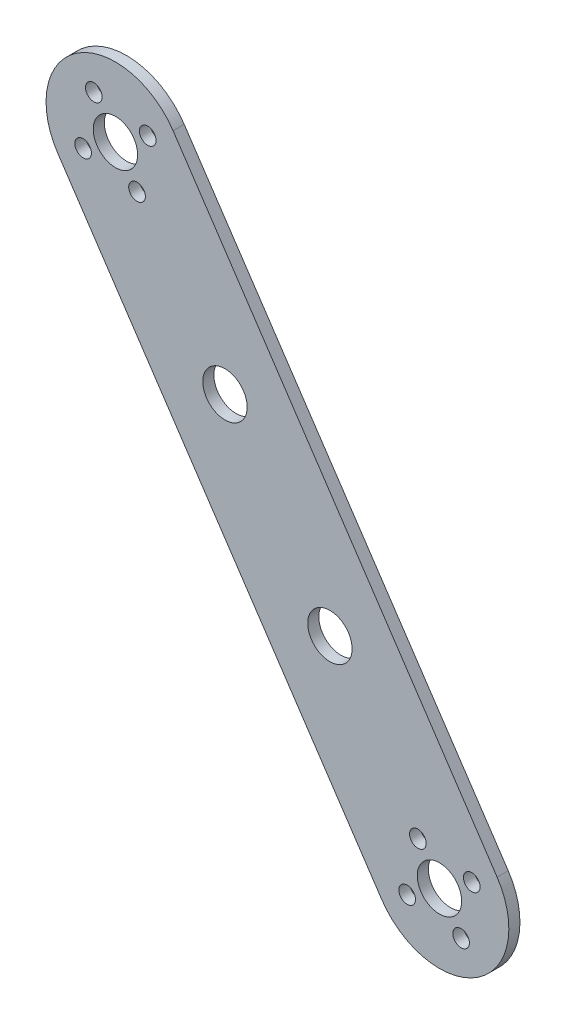
ISO-10303-21;
HEADER;
FILE_DESCRIPTION(('STEP AP214'),'2;1');
FILE_NAME('part.step','',(''),(''),'','','');
FILE_SCHEMA(('AUTOMOTIVE_DESIGN { 1 0 10303 214 1 1 1 1 }'));
ENDSEC;
DATA;
#1=APPLICATION_CONTEXT('core data for automotive mechanical design processes');
#2=APPLICATION_PROTOCOL_DEFINITION('international standard','automotive_design',2000,#1);
#3=PRODUCT_CONTEXT('',#1,'mechanical');
#4=PRODUCT('Part','Part','',(#3));
#5=PRODUCT_RELATED_PRODUCT_CATEGORY('part','',(#4));
#6=PRODUCT_DEFINITION_FORMATION('','',#4);
#7=PRODUCT_DEFINITION_CONTEXT('part definition',#1,'design');
#8=PRODUCT_DEFINITION('design','',#6,#7);
#9=PRODUCT_DEFINITION_SHAPE('','',#8);
#10=(LENGTH_UNIT() NAMED_UNIT(*) SI_UNIT(.MILLI.,.METRE.));
#11=(NAMED_UNIT(*) PLANE_ANGLE_UNIT() SI_UNIT($,.RADIAN.));
#12=(NAMED_UNIT(*) SI_UNIT($,.STERADIAN.) SOLID_ANGLE_UNIT());
#13=UNCERTAINTY_MEASURE_WITH_UNIT(LENGTH_MEASURE(1.E-05),#10,'distance_accuracy_value','');
#14=(GEOMETRIC_REPRESENTATION_CONTEXT(3) GLOBAL_UNCERTAINTY_ASSIGNED_CONTEXT((#13)) GLOBAL_UNIT_ASSIGNED_CONTEXT((#10,
#11,#12)) REPRESENTATION_CONTEXT('',''));
#15=CARTESIAN_POINT('',(0.,0.,0.));
#16=DIRECTION('',(0.,0.,1.));
#17=DIRECTION('',(1.,0.,0.));
#18=AXIS2_PLACEMENT_3D('',#15,#16,#17);
#19=CARTESIAN_POINT('',(-13.4999999999962,30.4999999999831,2.));
#20=DIRECTION('',(0.,0.,1.));
#21=DIRECTION('',(1.,0.,0.));
#22=AXIS2_PLACEMENT_3D('',#19,#20,#21);
#23=PLANE('',#22);
#24=CARTESIAN_POINT('',(-13.4999999999962,30.4999999999831,2.));
#25=DIRECTION('',(0.,0.,1.));
#26=DIRECTION('',(1.,0.,0.));
#27=AXIS2_PLACEMENT_3D('',#24,#25,#26);
#28=CIRCLE('',#27,4.);
#29=CARTESIAN_POINT('',(-9.49999999999621,30.4999999999831,2.));
#30=VERTEX_POINT('',#29);
#31=EDGE_CURVE('E170',#30,#30,#28,.T.);
#32=ORIENTED_EDGE('',*,*,#31,.F.);
#33=EDGE_LOOP('',(#32));
#34=FACE_BOUND('',#33,.T.);
#35=CARTESIAN_POINT('',(-17.3919102070971,36.3183360971731,2.));
#36=DIRECTION('',(0.,0.,1.));
#37=DIRECTION('',(1.,0.,0.));
#38=AXIS2_PLACEMENT_3D('',#35,#36,#37);
#39=CIRCLE('',#38,1.5);
#40=CARTESIAN_POINT('',(-15.8919102070971,36.3183360971731,2.));
#41=VERTEX_POINT('',#40);
#42=EDGE_CURVE('E158',#41,#41,#39,.T.);
#43=ORIENTED_EDGE('',*,*,#42,.F.);
#44=EDGE_LOOP('',(#43));
#45=FACE_BOUND('',#44,.T.);
#46=CARTESIAN_POINT('',(-9.60808979289533,24.6816639027932,2.));
#47=DIRECTION('',(0.,0.,1.));
#48=DIRECTION('',(1.,0.,0.));
#49=AXIS2_PLACEMENT_3D('',#46,#47,#48);
#50=CIRCLE('',#49,1.5);
#51=CARTESIAN_POINT('',(-8.10808979289533,24.6816639027932,2.));
#52=VERTEX_POINT('',#51);
#53=EDGE_CURVE('E146',#52,#52,#50,.T.);
#54=ORIENTED_EDGE('',*,*,#53,.F.);
#55=EDGE_LOOP('',(#54));
#56=FACE_BOUND('',#55,.T.);
#57=CARTESIAN_POINT('',(-33.2375446217221,60.0072759214466,2.));
#58=DIRECTION('',(0.,0.,1.));
#59=DIRECTION('',(1.,0.,0.));
#60=AXIS2_PLACEMENT_3D('',#57,#58,#59);
#61=CIRCLE('',#60,4.);
#62=CARTESIAN_POINT('',(-29.2375446217221,60.0072759214466,2.));
#63=VERTEX_POINT('',#62);
#64=EDGE_CURVE('E134',#63,#63,#61,.T.);
#65=ORIENTED_EDGE('',*,*,#64,.F.);
#66=EDGE_LOOP('',(#65));
#67=FACE_BOUND('',#66,.T.);
#68=CARTESIAN_POINT('',(-19.3183360971862,26.6080897928823,2.));
#69=DIRECTION('',(0.,0.,1.));
#70=DIRECTION('',(1.,0.,0.));
#71=AXIS2_PLACEMENT_3D('',#68,#69,#70);
#72=CIRCLE('',#71,1.5);
#73=CARTESIAN_POINT('',(-17.8183360971862,26.6080897928823,2.));
#74=VERTEX_POINT('',#73);
#75=EDGE_CURVE('E122',#74,#74,#72,.T.);
#76=ORIENTED_EDGE('',*,*,#75,.F.);
#77=EDGE_LOOP('',(#76));
#78=FACE_BOUND('',#77,.T.);
#79=CARTESIAN_POINT('',(-52.1411084847789,88.267765536374,2.));
#80=DIRECTION('',(0.,0.,1.));
#81=DIRECTION('',(1.,0.,0.));
#82=AXIS2_PLACEMENT_3D('',#79,#80,#81);
#83=CIRCLE('',#82,4.);
#84=CARTESIAN_POINT('',(-48.1411084847789,88.267765536374,2.));
#85=VERTEX_POINT('',#84);
#86=EDGE_CURVE('E101',#85,#85,#83,.T.);
#87=ORIENTED_EDGE('',*,*,#86,.F.);
#88=EDGE_LOOP('',(#87));
#89=FACE_BOUND('',#88,.T.);
#90=CARTESIAN_POINT('',(-13.4999999999962,30.4999999999831,2.));
#91=DIRECTION('',(0.,0.,1.));
#92=DIRECTION('',(1.,0.,0.));
#93=AXIS2_PLACEMENT_3D('',#90,#91,#92);
#94=CIRCLE('',#93,12.5);
#95=CARTESIAN_POINT('',(-23.8898858878363,23.550160344447,2.));
#96=VERTEX_POINT('',#95);
#97=CARTESIAN_POINT('',(-3.11011411215734,37.449839655521,2.));
#98=VERTEX_POINT('',#97);
#99=EDGE_CURVE('E86',#96,#98,#94,.T.);
#100=ORIENTED_EDGE('',*,*,#99,.T.);
#101=DIRECTION('',(-0.555987172442933,0.831190871027174,0.));
#102=VECTOR('',#101,1.);
#103=CARTESIAN_POINT('',(-61.4887672186656,124.724881113375,2.));
#104=LINE('',#103,#102);
#105=CARTESIAN_POINT('',(-61.4887672186656,124.724881113375,2.));
#106=VERTEX_POINT('',#105);
#107=EDGE_CURVE('E81',#98,#106,#104,.T.);
#108=ORIENTED_EDGE('',*,*,#107,.T.);
#109=CARTESIAN_POINT('',(-71.8786531065049,117.775041457837,2.));
#110=DIRECTION('',(0.,0.,1.));
#111=DIRECTION('',(1.,0.,0.));
#112=AXIS2_PLACEMENT_3D('',#109,#110,#111);
#113=CIRCLE('',#112,12.5);
#114=CARTESIAN_POINT('',(-82.2685389943441,110.8252018023,2.));
#115=VERTEX_POINT('',#114);
#116=EDGE_CURVE('E84',#106,#115,#113,.T.);
#117=ORIENTED_EDGE('',*,*,#116,.T.);
#118=DIRECTION('',(0.555987172442933,-0.831190871027174,0.));
#119=VECTOR('',#118,1.);
#120=CARTESIAN_POINT('',(-23.8898858878363,23.550160344447,2.));
#121=LINE('',#120,#119);
#122=EDGE_CURVE('E51',#115,#96,#121,.T.);
#123=ORIENTED_EDGE('',*,*,#122,.T.);
#124=EDGE_LOOP('',(#100,#108,#117,#123));
#125=FACE_BOUND('',#124,.T.);
#126=CARTESIAN_POINT('',(-66.0603170093149,121.666951664938,2.));
#127=DIRECTION('',(0.,0.,1.));
#128=DIRECTION('',(1.,0.,0.));
#129=AXIS2_PLACEMENT_3D('',#126,#127,#128);
#130=CIRCLE('',#129,1.5);
#131=CARTESIAN_POINT('',(-64.5603170093149,121.666951664938,2.));
#132=VERTEX_POINT('',#131);
#133=EDGE_CURVE('E116',#132,#132,#130,.T.);
#134=ORIENTED_EDGE('',*,*,#133,.F.);
#135=EDGE_LOOP('',(#134));
#136=FACE_BOUND('',#135,.T.);
#137=CARTESIAN_POINT('',(-75.7705633136057,123.593377555027,2.));
#138=DIRECTION('',(0.,0.,1.));
#139=DIRECTION('',(1.,0.,0.));
#140=AXIS2_PLACEMENT_3D('',#137,#138,#139);
#141=CIRCLE('',#140,1.5);
#142=CARTESIAN_POINT('',(-74.2705633136057,123.593377555027,2.));
#143=VERTEX_POINT('',#142);
#144=EDGE_CURVE('E128',#143,#143,#141,.T.);
#145=ORIENTED_EDGE('',*,*,#144,.F.);
#146=EDGE_LOOP('',(#145));
#147=FACE_BOUND('',#146,.T.);
#148=CARTESIAN_POINT('',(-67.986742899404,111.956705360647,2.));
#149=DIRECTION('',(0.,0.,1.));
#150=DIRECTION('',(1.,0.,0.));
#151=AXIS2_PLACEMENT_3D('',#148,#149,#150);
#152=CIRCLE('',#151,1.5);
#153=CARTESIAN_POINT('',(-66.486742899404,111.956705360647,2.));
#154=VERTEX_POINT('',#153);
#155=EDGE_CURVE('E140',#154,#154,#152,.T.);
#156=ORIENTED_EDGE('',*,*,#155,.F.);
#157=EDGE_LOOP('',(#156));
#158=FACE_BOUND('',#157,.T.);
#159=CARTESIAN_POINT('',(-71.8786531065049,117.775041457837,2.));
#160=DIRECTION('',(0.,0.,1.));
#161=DIRECTION('',(1.,0.,0.));
#162=AXIS2_PLACEMENT_3D('',#159,#160,#161);
#163=CIRCLE('',#162,4.00000000000001);
#164=CARTESIAN_POINT('',(-67.8786531065049,117.775041457837,2.));
#165=VERTEX_POINT('',#164);
#166=EDGE_CURVE('E152',#165,#165,#163,.T.);
#167=ORIENTED_EDGE('',*,*,#166,.F.);
#168=EDGE_LOOP('',(#167));
#169=FACE_BOUND('',#168,.T.);
#170=CARTESIAN_POINT('',(-77.6969892036948,113.883131250737,2.));
#171=DIRECTION('',(0.,0.,1.));
#172=DIRECTION('',(1.,0.,0.));
#173=AXIS2_PLACEMENT_3D('',#170,#171,#172);
#174=CIRCLE('',#173,1.5);
#175=CARTESIAN_POINT('',(-76.1969892036948,113.883131250737,2.));
#176=VERTEX_POINT('',#175);
#177=EDGE_CURVE('E164',#176,#176,#174,.T.);
#178=ORIENTED_EDGE('',*,*,#177,.F.);
#179=EDGE_LOOP('',(#178));
#180=FACE_BOUND('',#179,.T.);
#181=CARTESIAN_POINT('',(-7.68166390280623,34.391910207084,2.));
#182=DIRECTION('',(0.,0.,1.));
#183=DIRECTION('',(1.,0.,0.));
#184=AXIS2_PLACEMENT_3D('',#181,#182,#183);
#185=CIRCLE('',#184,1.5);
#186=CARTESIAN_POINT('',(-6.18166390280623,34.391910207084,2.));
#187=VERTEX_POINT('',#186);
#188=EDGE_CURVE('E176',#187,#187,#185,.T.);
#189=ORIENTED_EDGE('',*,*,#188,.F.);
#190=EDGE_LOOP('',(#189));
#191=FACE_BOUND('',#190,.T.);
#192=ADVANCED_FACE('F34',(#34,#45,#56,#67,#78,#89,#125,#136,#147,#158,#169,#180,#191),#23,.T.);
#193=CARTESIAN_POINT('',(-13.4999999999962,30.4999999999831,0.));
#194=DIRECTION('',(0.,0.,1.));
#195=DIRECTION('',(1.,0.,0.));
#196=AXIS2_PLACEMENT_3D('',#193,#194,#195);
#197=PLANE('',#196);
#198=CARTESIAN_POINT('',(-13.4999999999962,30.4999999999831,0.));
#199=DIRECTION('',(0.,0.,1.));
#200=DIRECTION('',(1.,0.,0.));
#201=AXIS2_PLACEMENT_3D('',#198,#199,#200);
#202=CIRCLE('',#201,12.5);
#203=CARTESIAN_POINT('',(-23.8898858878363,23.550160344447,0.));
#204=VERTEX_POINT('',#203);
#205=CARTESIAN_POINT('',(-3.11011411215734,37.449839655521,0.));
#206=VERTEX_POINT('',#205);
#207=EDGE_CURVE('E98',#204,#206,#202,.T.);
#208=ORIENTED_EDGE('',*,*,#207,.F.);
#209=DIRECTION('',(0.555987172442933,-0.831190871027174,0.));
#210=VECTOR('',#209,1.);
#211=CARTESIAN_POINT('',(-23.8898858878363,23.550160344447,0.));
#212=LINE('',#211,#210);
#213=CARTESIAN_POINT('',(-82.2685389943441,110.8252018023,0.));
#214=VERTEX_POINT('',#213);
#215=EDGE_CURVE('E74',#214,#204,#212,.T.);
#216=ORIENTED_EDGE('',*,*,#215,.F.);
#217=CARTESIAN_POINT('',(-71.8786531065049,117.775041457837,0.));
#218=DIRECTION('',(0.,0.,1.));
#219=DIRECTION('',(1.,0.,0.));
#220=AXIS2_PLACEMENT_3D('',#217,#218,#219);
#221=CIRCLE('',#220,12.5);
#222=CARTESIAN_POINT('',(-61.4887672186656,124.724881113375,0.));
#223=VERTEX_POINT('',#222);
#224=EDGE_CURVE('E68',#223,#214,#221,.T.);
#225=ORIENTED_EDGE('',*,*,#224,.F.);
#226=DIRECTION('',(-0.555987172442933,0.831190871027174,0.));
#227=VECTOR('',#226,1.);
#228=CARTESIAN_POINT('',(-61.4887672186656,124.724881113375,0.));
#229=LINE('',#228,#227);
#230=EDGE_CURVE('E90',#206,#223,#229,.T.);
#231=ORIENTED_EDGE('',*,*,#230,.F.);
#232=EDGE_LOOP('',(#208,#216,#225,#231));
#233=FACE_BOUND('',#232,.T.);
#234=CARTESIAN_POINT('',(-52.1411084847789,88.267765536374,0.));
#235=DIRECTION('',(0.,0.,1.));
#236=DIRECTION('',(1.,0.,0.));
#237=AXIS2_PLACEMENT_3D('',#234,#235,#236);
#238=CIRCLE('',#237,4.);
#239=CARTESIAN_POINT('',(-48.1411084847789,88.267765536374,0.));
#240=VERTEX_POINT('',#239);
#241=EDGE_CURVE('E113',#240,#240,#238,.T.);
#242=ORIENTED_EDGE('',*,*,#241,.T.);
#243=EDGE_LOOP('',(#242));
#244=FACE_BOUND('',#243,.T.);
#245=CARTESIAN_POINT('',(-66.0603170093149,121.666951664938,0.));
#246=DIRECTION('',(0.,0.,1.));
#247=DIRECTION('',(1.,0.,0.));
#248=AXIS2_PLACEMENT_3D('',#245,#246,#247);
#249=CIRCLE('',#248,1.5);
#250=CARTESIAN_POINT('',(-64.5603170093149,121.666951664938,0.));
#251=VERTEX_POINT('',#250);
#252=EDGE_CURVE('E119',#251,#251,#249,.T.);
#253=ORIENTED_EDGE('',*,*,#252,.T.);
#254=EDGE_LOOP('',(#253));
#255=FACE_BOUND('',#254,.T.);
#256=CARTESIAN_POINT('',(-19.3183360971862,26.6080897928823,0.));
#257=DIRECTION('',(0.,0.,1.));
#258=DIRECTION('',(1.,0.,0.));
#259=AXIS2_PLACEMENT_3D('',#256,#257,#258);
#260=CIRCLE('',#259,1.5);
#261=CARTESIAN_POINT('',(-17.8183360971862,26.6080897928823,0.));
#262=VERTEX_POINT('',#261);
#263=EDGE_CURVE('E125',#262,#262,#260,.T.);
#264=ORIENTED_EDGE('',*,*,#263,.T.);
#265=EDGE_LOOP('',(#264));
#266=FACE_BOUND('',#265,.T.);
#267=CARTESIAN_POINT('',(-75.7705633136057,123.593377555027,0.));
#268=DIRECTION('',(0.,0.,1.));
#269=DIRECTION('',(1.,0.,0.));
#270=AXIS2_PLACEMENT_3D('',#267,#268,#269);
#271=CIRCLE('',#270,1.5);
#272=CARTESIAN_POINT('',(-74.2705633136057,123.593377555027,0.));
#273=VERTEX_POINT('',#272);
#274=EDGE_CURVE('E131',#273,#273,#271,.T.);
#275=ORIENTED_EDGE('',*,*,#274,.T.);
#276=EDGE_LOOP('',(#275));
#277=FACE_BOUND('',#276,.T.);
#278=CARTESIAN_POINT('',(-33.2375446217221,60.0072759214466,0.));
#279=DIRECTION('',(0.,0.,1.));
#280=DIRECTION('',(1.,0.,0.));
#281=AXIS2_PLACEMENT_3D('',#278,#279,#280);
#282=CIRCLE('',#281,4.);
#283=CARTESIAN_POINT('',(-29.2375446217221,60.0072759214466,0.));
#284=VERTEX_POINT('',#283);
#285=EDGE_CURVE('E137',#284,#284,#282,.T.);
#286=ORIENTED_EDGE('',*,*,#285,.T.);
#287=EDGE_LOOP('',(#286));
#288=FACE_BOUND('',#287,.T.);
#289=CARTESIAN_POINT('',(-67.986742899404,111.956705360647,0.));
#290=DIRECTION('',(0.,0.,1.));
#291=DIRECTION('',(1.,0.,0.));
#292=AXIS2_PLACEMENT_3D('',#289,#290,#291);
#293=CIRCLE('',#292,1.5);
#294=CARTESIAN_POINT('',(-66.486742899404,111.956705360647,0.));
#295=VERTEX_POINT('',#294);
#296=EDGE_CURVE('E143',#295,#295,#293,.T.);
#297=ORIENTED_EDGE('',*,*,#296,.T.);
#298=EDGE_LOOP('',(#297));
#299=FACE_BOUND('',#298,.T.);
#300=CARTESIAN_POINT('',(-9.60808979289533,24.6816639027932,0.));
#301=DIRECTION('',(0.,0.,1.));
#302=DIRECTION('',(1.,0.,0.));
#303=AXIS2_PLACEMENT_3D('',#300,#301,#302);
#304=CIRCLE('',#303,1.5);
#305=CARTESIAN_POINT('',(-8.10808979289533,24.6816639027932,0.));
#306=VERTEX_POINT('',#305);
#307=EDGE_CURVE('E149',#306,#306,#304,.T.);
#308=ORIENTED_EDGE('',*,*,#307,.T.);
#309=EDGE_LOOP('',(#308));
#310=FACE_BOUND('',#309,.T.);
#311=CARTESIAN_POINT('',(-71.8786531065049,117.775041457837,0.));
#312=DIRECTION('',(0.,0.,1.));
#313=DIRECTION('',(1.,0.,0.));
#314=AXIS2_PLACEMENT_3D('',#311,#312,#313);
#315=CIRCLE('',#314,4.00000000000001);
#316=CARTESIAN_POINT('',(-67.8786531065049,117.775041457837,0.));
#317=VERTEX_POINT('',#316);
#318=EDGE_CURVE('E155',#317,#317,#315,.T.);
#319=ORIENTED_EDGE('',*,*,#318,.T.);
#320=EDGE_LOOP('',(#319));
#321=FACE_BOUND('',#320,.T.);
#322=CARTESIAN_POINT('',(-17.3919102070971,36.3183360971731,0.));
#323=DIRECTION('',(0.,0.,1.));
#324=DIRECTION('',(1.,0.,0.));
#325=AXIS2_PLACEMENT_3D('',#322,#323,#324);
#326=CIRCLE('',#325,1.5);
#327=CARTESIAN_POINT('',(-15.8919102070971,36.3183360971731,0.));
#328=VERTEX_POINT('',#327);
#329=EDGE_CURVE('E161',#328,#328,#326,.T.);
#330=ORIENTED_EDGE('',*,*,#329,.T.);
#331=EDGE_LOOP('',(#330));
#332=FACE_BOUND('',#331,.T.);
#333=CARTESIAN_POINT('',(-77.6969892036948,113.883131250737,0.));
#334=DIRECTION('',(0.,0.,1.));
#335=DIRECTION('',(1.,0.,0.));
#336=AXIS2_PLACEMENT_3D('',#333,#334,#335);
#337=CIRCLE('',#336,1.5);
#338=CARTESIAN_POINT('',(-76.1969892036948,113.883131250737,0.));
#339=VERTEX_POINT('',#338);
#340=EDGE_CURVE('E167',#339,#339,#337,.T.);
#341=ORIENTED_EDGE('',*,*,#340,.T.);
#342=EDGE_LOOP('',(#341));
#343=FACE_BOUND('',#342,.T.);
#344=CARTESIAN_POINT('',(-13.4999999999962,30.4999999999831,0.));
#345=DIRECTION('',(0.,0.,1.));
#346=DIRECTION('',(1.,0.,0.));
#347=AXIS2_PLACEMENT_3D('',#344,#345,#346);
#348=CIRCLE('',#347,4.);
#349=CARTESIAN_POINT('',(-9.49999999999621,30.4999999999831,0.));
#350=VERTEX_POINT('',#349);
#351=EDGE_CURVE('E173',#350,#350,#348,.T.);
#352=ORIENTED_EDGE('',*,*,#351,.T.);
#353=EDGE_LOOP('',(#352));
#354=FACE_BOUND('',#353,.T.);
#355=CARTESIAN_POINT('',(-7.68166390280623,34.391910207084,0.));
#356=DIRECTION('',(0.,0.,1.));
#357=DIRECTION('',(1.,0.,0.));
#358=AXIS2_PLACEMENT_3D('',#355,#356,#357);
#359=CIRCLE('',#358,1.5);
#360=CARTESIAN_POINT('',(-6.18166390280623,34.391910207084,0.));
#361=VERTEX_POINT('',#360);
#362=EDGE_CURVE('E179',#361,#361,#359,.T.);
#363=ORIENTED_EDGE('',*,*,#362,.T.);
#364=EDGE_LOOP('',(#363));
#365=FACE_BOUND('',#364,.T.);
#366=ADVANCED_FACE('F109',(#233,#244,#255,#266,#277,#288,#299,#310,#321,#332,#343,#354,#365),
#197,.F.);
#367=CARTESIAN_POINT('',(-13.4999999999962,30.4999999999831,2.));
#368=DIRECTION('',(0.,0.,-1.));
#369=DIRECTION('',(-1.,0.,0.));
#370=AXIS2_PLACEMENT_3D('',#367,#368,#369);
#371=CYLINDRICAL_SURFACE('',#370,12.5);
#372=ORIENTED_EDGE('',*,*,#207,.T.);
#373=DIRECTION('',(0.,0.,-1.));
#374=VECTOR('',#373,1.);
#375=CARTESIAN_POINT('',(-3.11011411215734,37.449839655521,2.));
#376=LINE('',#375,#374);
#377=EDGE_CURVE('E11',#98,#206,#376,.T.);
#378=ORIENTED_EDGE('',*,*,#377,.F.);
#379=ORIENTED_EDGE('',*,*,#99,.F.);
#380=DIRECTION('',(0.,0.,-1.));
#381=VECTOR('',#380,1.);
#382=CARTESIAN_POINT('',(-23.8898858878363,23.550160344447,2.));
#383=LINE('',#382,#381);
#384=EDGE_CURVE('E94',#96,#204,#383,.T.);
#385=ORIENTED_EDGE('',*,*,#384,.T.);
#386=EDGE_LOOP('',(#372,#378,#379,#385));
#387=FACE_BOUND('',#386,.T.);
#388=ADVANCED_FACE('F36',(#387),#371,.T.);
#389=CARTESIAN_POINT('',(-61.4887672186656,124.724881113375,2.));
#390=DIRECTION('',(-0.831190871027174,-0.555987172442933,0.));
#391=DIRECTION('',(0.555987172442933,-0.831190871027174,0.));
#392=AXIS2_PLACEMENT_3D('',#389,#390,#391);
#393=PLANE('',#392);
#394=ORIENTED_EDGE('',*,*,#230,.T.);
#395=DIRECTION('',(0.,0.,-1.));
#396=VECTOR('',#395,1.);
#397=CARTESIAN_POINT('',(-61.4887672186656,124.724881113375,2.));
#398=LINE('',#397,#396);
#399=EDGE_CURVE('E43',#106,#223,#398,.T.);
#400=ORIENTED_EDGE('',*,*,#399,.F.);
#401=ORIENTED_EDGE('',*,*,#107,.F.);
#402=ORIENTED_EDGE('',*,*,#377,.T.);
#403=EDGE_LOOP('',(#394,#400,#401,#402));
#404=FACE_BOUND('',#403,.T.);
#405=ADVANCED_FACE('F89',(#404),#393,.F.);
#406=CARTESIAN_POINT('',(-71.8786531065049,117.775041457837,2.));
#407=DIRECTION('',(0.,0.,-1.));
#408=DIRECTION('',(-1.,0.,0.));
#409=AXIS2_PLACEMENT_3D('',#406,#407,#408);
#410=CYLINDRICAL_SURFACE('',#409,12.5);
#411=ORIENTED_EDGE('',*,*,#224,.T.);
#412=DIRECTION('',(0.,0.,-1.));
#413=VECTOR('',#412,1.);
#414=CARTESIAN_POINT('',(-82.2685389943441,110.8252018023,2.));
#415=LINE('',#414,#413);
#416=EDGE_CURVE('E91',#115,#214,#415,.T.);
#417=ORIENTED_EDGE('',*,*,#416,.F.);
#418=ORIENTED_EDGE('',*,*,#116,.F.);
#419=ORIENTED_EDGE('',*,*,#399,.T.);
#420=EDGE_LOOP('',(#411,#417,#418,#419));
#421=FACE_BOUND('',#420,.T.);
#422=ADVANCED_FACE('F92',(#421),#410,.T.);
#423=CARTESIAN_POINT('',(-23.8898858878363,23.550160344447,2.));
#424=DIRECTION('',(0.831190871027174,0.555987172442933,0.));
#425=DIRECTION('',(-0.555987172442933,0.831190871027174,0.));
#426=AXIS2_PLACEMENT_3D('',#423,#424,#425);
#427=PLANE('',#426);
#428=ORIENTED_EDGE('',*,*,#215,.T.);
#429=ORIENTED_EDGE('',*,*,#384,.F.);
#430=ORIENTED_EDGE('',*,*,#122,.F.);
#431=ORIENTED_EDGE('',*,*,#416,.T.);
#432=EDGE_LOOP('',(#428,#429,#430,#431));
#433=FACE_BOUND('',#432,.T.);
#434=ADVANCED_FACE('F106',(#433),#427,.F.);
#435=CARTESIAN_POINT('',(-52.1411084847789,88.267765536374,2.));
#436=DIRECTION('',(0.,0.,-1.));
#437=DIRECTION('',(-1.,0.,0.));
#438=AXIS2_PLACEMENT_3D('',#435,#436,#437);
#439=CYLINDRICAL_SURFACE('',#438,4.);
#440=ORIENTED_EDGE('',*,*,#86,.T.);
#441=EDGE_LOOP('',(#440));
#442=FACE_BOUND('',#441,.T.);
#443=ORIENTED_EDGE('',*,*,#241,.F.);
#444=EDGE_LOOP('',(#443));
#445=FACE_BOUND('',#444,.T.);
#446=ADVANCED_FACE('F198',(#442,#445),#439,.F.);
#447=CARTESIAN_POINT('',(-66.0603170093149,121.666951664938,2.));
#448=DIRECTION('',(0.,0.,-1.));
#449=DIRECTION('',(-1.,0.,0.));
#450=AXIS2_PLACEMENT_3D('',#447,#448,#449);
#451=CYLINDRICAL_SURFACE('',#450,1.5);
#452=ORIENTED_EDGE('',*,*,#133,.T.);
#453=EDGE_LOOP('',(#452));
#454=FACE_BOUND('',#453,.T.);
#455=ORIENTED_EDGE('',*,*,#252,.F.);
#456=EDGE_LOOP('',(#455));
#457=FACE_BOUND('',#456,.T.);
#458=ADVANCED_FACE('F244',(#454,#457),#451,.F.);
#459=CARTESIAN_POINT('',(-19.3183360971862,26.6080897928823,2.));
#460=DIRECTION('',(0.,0.,-1.));
#461=DIRECTION('',(-1.,0.,0.));
#462=AXIS2_PLACEMENT_3D('',#459,#460,#461);
#463=CYLINDRICAL_SURFACE('',#462,1.5);
#464=ORIENTED_EDGE('',*,*,#75,.T.);
#465=EDGE_LOOP('',(#464));
#466=FACE_BOUND('',#465,.T.);
#467=ORIENTED_EDGE('',*,*,#263,.F.);
#468=EDGE_LOOP('',(#467));
#469=FACE_BOUND('',#468,.T.);
#470=ADVANCED_FACE('F252',(#466,#469),#463,.F.);
#471=CARTESIAN_POINT('',(-75.7705633136057,123.593377555027,2.));
#472=DIRECTION('',(0.,0.,-1.));
#473=DIRECTION('',(-1.,0.,0.));
#474=AXIS2_PLACEMENT_3D('',#471,#472,#473);
#475=CYLINDRICAL_SURFACE('',#474,1.5);
#476=ORIENTED_EDGE('',*,*,#144,.T.);
#477=EDGE_LOOP('',(#476));
#478=FACE_BOUND('',#477,.T.);
#479=ORIENTED_EDGE('',*,*,#274,.F.);
#480=EDGE_LOOP('',(#479));
#481=FACE_BOUND('',#480,.T.);
#482=ADVANCED_FACE('F260',(#478,#481),#475,.F.);
#483=CARTESIAN_POINT('',(-33.2375446217221,60.0072759214466,2.));
#484=DIRECTION('',(0.,0.,-1.));
#485=DIRECTION('',(-1.,0.,0.));
#486=AXIS2_PLACEMENT_3D('',#483,#484,#485);
#487=CYLINDRICAL_SURFACE('',#486,4.);
#488=ORIENTED_EDGE('',*,*,#64,.T.);
#489=EDGE_LOOP('',(#488));
#490=FACE_BOUND('',#489,.T.);
#491=ORIENTED_EDGE('',*,*,#285,.F.);
#492=EDGE_LOOP('',(#491));
#493=FACE_BOUND('',#492,.T.);
#494=ADVANCED_FACE('F269',(#490,#493),#487,.F.);
#495=CARTESIAN_POINT('',(-67.986742899404,111.956705360647,2.));
#496=DIRECTION('',(0.,0.,-1.));
#497=DIRECTION('',(-1.,0.,0.));
#498=AXIS2_PLACEMENT_3D('',#495,#496,#497);
#499=CYLINDRICAL_SURFACE('',#498,1.5);
#500=ORIENTED_EDGE('',*,*,#155,.T.);
#501=EDGE_LOOP('',(#500));
#502=FACE_BOUND('',#501,.T.);
#503=ORIENTED_EDGE('',*,*,#296,.F.);
#504=EDGE_LOOP('',(#503));
#505=FACE_BOUND('',#504,.T.);
#506=ADVANCED_FACE('F278',(#502,#505),#499,.F.);
#507=CARTESIAN_POINT('',(-9.60808979289533,24.6816639027932,2.));
#508=DIRECTION('',(0.,0.,-1.));
#509=DIRECTION('',(-1.,0.,0.));
#510=AXIS2_PLACEMENT_3D('',#507,#508,#509);
#511=CYLINDRICAL_SURFACE('',#510,1.5);
#512=ORIENTED_EDGE('',*,*,#53,.T.);
#513=EDGE_LOOP('',(#512));
#514=FACE_BOUND('',#513,.T.);
#515=ORIENTED_EDGE('',*,*,#307,.F.);
#516=EDGE_LOOP('',(#515));
#517=FACE_BOUND('',#516,.T.);
#518=ADVANCED_FACE('F287',(#514,#517),#511,.F.);
#519=CARTESIAN_POINT('',(-71.8786531065049,117.775041457837,2.));
#520=DIRECTION('',(0.,0.,-1.));
#521=DIRECTION('',(-1.,0.,0.));
#522=AXIS2_PLACEMENT_3D('',#519,#520,#521);
#523=CYLINDRICAL_SURFACE('',#522,4.00000000000001);
#524=ORIENTED_EDGE('',*,*,#166,.T.);
#525=EDGE_LOOP('',(#524));
#526=FACE_BOUND('',#525,.T.);
#527=ORIENTED_EDGE('',*,*,#318,.F.);
#528=EDGE_LOOP('',(#527));
#529=FACE_BOUND('',#528,.T.);
#530=ADVANCED_FACE('F296',(#526,#529),#523,.F.);
#531=CARTESIAN_POINT('',(-17.3919102070971,36.3183360971731,2.));
#532=DIRECTION('',(0.,0.,-1.));
#533=DIRECTION('',(-1.,0.,0.));
#534=AXIS2_PLACEMENT_3D('',#531,#532,#533);
#535=CYLINDRICAL_SURFACE('',#534,1.5);
#536=ORIENTED_EDGE('',*,*,#42,.T.);
#537=EDGE_LOOP('',(#536));
#538=FACE_BOUND('',#537,.T.);
#539=ORIENTED_EDGE('',*,*,#329,.F.);
#540=EDGE_LOOP('',(#539));
#541=FACE_BOUND('',#540,.T.);
#542=ADVANCED_FACE('F305',(#538,#541),#535,.F.);
#543=CARTESIAN_POINT('',(-77.6969892036948,113.883131250737,2.));
#544=DIRECTION('',(0.,0.,-1.));
#545=DIRECTION('',(-1.,0.,0.));
#546=AXIS2_PLACEMENT_3D('',#543,#544,#545);
#547=CYLINDRICAL_SURFACE('',#546,1.5);
#548=ORIENTED_EDGE('',*,*,#177,.T.);
#549=EDGE_LOOP('',(#548));
#550=FACE_BOUND('',#549,.T.);
#551=ORIENTED_EDGE('',*,*,#340,.F.);
#552=EDGE_LOOP('',(#551));
#553=FACE_BOUND('',#552,.T.);
#554=ADVANCED_FACE('F314',(#550,#553),#547,.F.);
#555=CARTESIAN_POINT('',(-13.4999999999962,30.4999999999831,2.));
#556=DIRECTION('',(0.,0.,-1.));
#557=DIRECTION('',(-1.,0.,0.));
#558=AXIS2_PLACEMENT_3D('',#555,#556,#557);
#559=CYLINDRICAL_SURFACE('',#558,4.);
#560=ORIENTED_EDGE('',*,*,#31,.T.);
#561=EDGE_LOOP('',(#560));
#562=FACE_BOUND('',#561,.T.);
#563=ORIENTED_EDGE('',*,*,#351,.F.);
#564=EDGE_LOOP('',(#563));
#565=FACE_BOUND('',#564,.T.);
#566=ADVANCED_FACE('F323',(#562,#565),#559,.F.);
#567=CARTESIAN_POINT('',(-7.68166390280623,34.391910207084,2.));
#568=DIRECTION('',(0.,0.,-1.));
#569=DIRECTION('',(-1.,0.,0.));
#570=AXIS2_PLACEMENT_3D('',#567,#568,#569);
#571=CYLINDRICAL_SURFACE('',#570,1.5);
#572=ORIENTED_EDGE('',*,*,#188,.T.);
#573=EDGE_LOOP('',(#572));
#574=FACE_BOUND('',#573,.T.);
#575=ORIENTED_EDGE('',*,*,#362,.F.);
#576=EDGE_LOOP('',(#575));
#577=FACE_BOUND('',#576,.T.);
#578=ADVANCED_FACE('F185',(#574,#577),#571,.F.);
#579=CLOSED_SHELL('',(#192,#366,#388,#405,#422,#434,#446,#458,#470,#482,#494,#506,#518,#530,
#542,#554,#566,#578));
#580=MANIFOLD_SOLID_BREP('B2',#579);
#581=ADVANCED_BREP_SHAPE_REPRESENTATION('',(#18,#580),#14);
#582=SHAPE_DEFINITION_REPRESENTATION(#9,#581);
ENDSEC;
END-ISO-10303-21;
